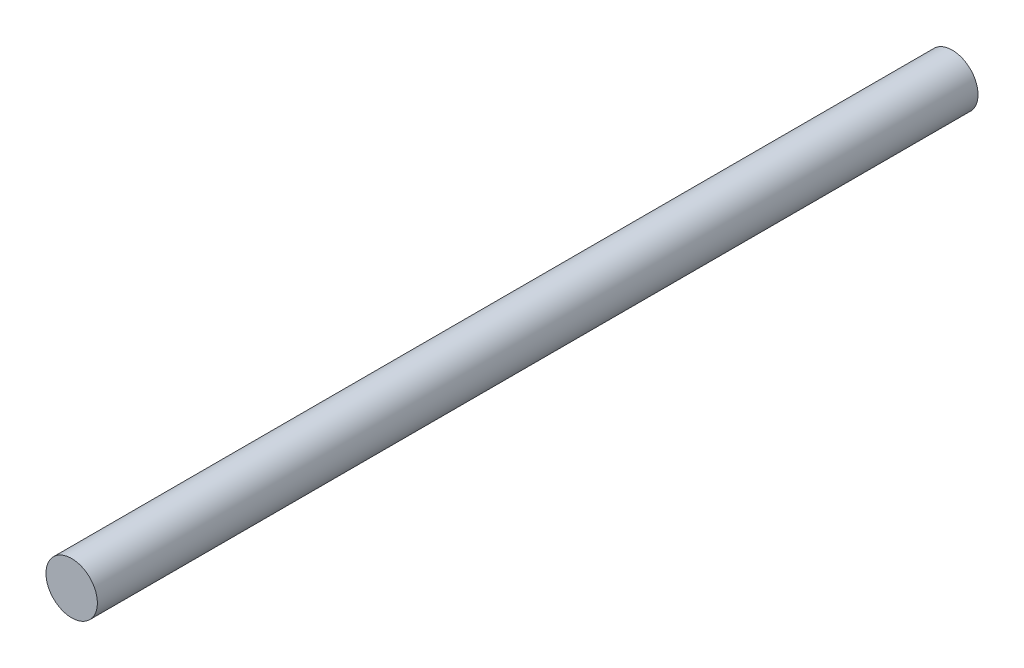
ISO-10303-21;
HEADER;
FILE_DESCRIPTION(('STEP AP214'),'2;1');
FILE_NAME('part.step','',(''),(''),'','','');
FILE_SCHEMA(('AUTOMOTIVE_DESIGN { 1 0 10303 214 1 1 1 1 }'));
ENDSEC;
DATA;
#1=APPLICATION_CONTEXT('core data for automotive mechanical design processes');
#2=APPLICATION_PROTOCOL_DEFINITION('international standard','automotive_design',2000,#1);
#3=PRODUCT_CONTEXT('',#1,'mechanical');
#4=PRODUCT('Part','Part','',(#3));
#5=PRODUCT_RELATED_PRODUCT_CATEGORY('part','',(#4));
#6=PRODUCT_DEFINITION_FORMATION('','',#4);
#7=PRODUCT_DEFINITION_CONTEXT('part definition',#1,'design');
#8=PRODUCT_DEFINITION('design','',#6,#7);
#9=PRODUCT_DEFINITION_SHAPE('','',#8);
#10=(LENGTH_UNIT() NAMED_UNIT(*) SI_UNIT(.MILLI.,.METRE.));
#11=(NAMED_UNIT(*) PLANE_ANGLE_UNIT() SI_UNIT($,.RADIAN.));
#12=(NAMED_UNIT(*) SI_UNIT($,.STERADIAN.) SOLID_ANGLE_UNIT());
#13=UNCERTAINTY_MEASURE_WITH_UNIT(LENGTH_MEASURE(1.E-05),#10,'distance_accuracy_value','');
#14=(GEOMETRIC_REPRESENTATION_CONTEXT(3) GLOBAL_UNCERTAINTY_ASSIGNED_CONTEXT((#13)) GLOBAL_UNIT_ASSIGNED_CONTEXT((#10,
#11,#12)) REPRESENTATION_CONTEXT('',''));
#15=CARTESIAN_POINT('',(0.,0.,0.));
#16=DIRECTION('',(0.,0.,1.));
#17=DIRECTION('',(1.,0.,0.));
#18=AXIS2_PLACEMENT_3D('',#15,#16,#17);
#19=CARTESIAN_POINT('',(0.,0.,135.89));
#20=DIRECTION('',(0.,0.,-1.));
#21=DIRECTION('',(-1.,0.,0.));
#22=AXIS2_PLACEMENT_3D('',#19,#20,#21);
#23=CYLINDRICAL_SURFACE('',#22,7.9375);
#24=CARTESIAN_POINT('',(0.,0.,135.89));
#25=DIRECTION('',(0.,0.,1.));
#26=DIRECTION('',(1.,0.,0.));
#27=AXIS2_PLACEMENT_3D('',#24,#25,#26);
#28=CIRCLE('',#27,7.9375);
#29=CARTESIAN_POINT('',(7.9375,0.,135.89));
#30=VERTEX_POINT('',#29);
#31=EDGE_CURVE('E10',#30,#30,#28,.T.);
#32=ORIENTED_EDGE('',*,*,#31,.F.);
#33=EDGE_LOOP('',(#32));
#34=FACE_BOUND('',#33,.T.);
#35=CARTESIAN_POINT('',(0.,0.,-135.89));
#36=DIRECTION('',(0.,0.,1.));
#37=DIRECTION('',(1.,0.,0.));
#38=AXIS2_PLACEMENT_3D('',#35,#36,#37);
#39=CIRCLE('',#38,7.9375);
#40=CARTESIAN_POINT('',(7.9375,0.,-135.89));
#41=VERTEX_POINT('',#40);
#42=EDGE_CURVE('E33',#41,#41,#39,.T.);
#43=ORIENTED_EDGE('',*,*,#42,.T.);
#44=EDGE_LOOP('',(#43));
#45=FACE_BOUND('',#44,.T.);
#46=ADVANCED_FACE('F30',(#34,#45),#23,.T.);
#47=CARTESIAN_POINT('',(0.,0.,135.89));
#48=DIRECTION('',(0.,0.,1.));
#49=DIRECTION('',(1.,0.,0.));
#50=AXIS2_PLACEMENT_3D('',#47,#48,#49);
#51=PLANE('',#50);
#52=ORIENTED_EDGE('',*,*,#31,.T.);
#53=EDGE_LOOP('',(#52));
#54=FACE_BOUND('',#53,.T.);
#55=ADVANCED_FACE('F45',(#54),#51,.T.);
#56=CARTESIAN_POINT('',(0.,0.,-135.89));
#57=DIRECTION('',(0.,0.,1.));
#58=DIRECTION('',(1.,0.,0.));
#59=AXIS2_PLACEMENT_3D('',#56,#57,#58);
#60=PLANE('',#59);
#61=ORIENTED_EDGE('',*,*,#42,.F.);
#62=EDGE_LOOP('',(#61));
#63=FACE_BOUND('',#62,.T.);
#64=ADVANCED_FACE('F43',(#63),#60,.F.);
#65=CLOSED_SHELL('',(#46,#55,#64));
#66=MANIFOLD_SOLID_BREP('B2',#65);
#67=ADVANCED_BREP_SHAPE_REPRESENTATION('',(#18,#66),#14);
#68=SHAPE_DEFINITION_REPRESENTATION(#9,#67);
ENDSEC;
END-ISO-10303-21;
